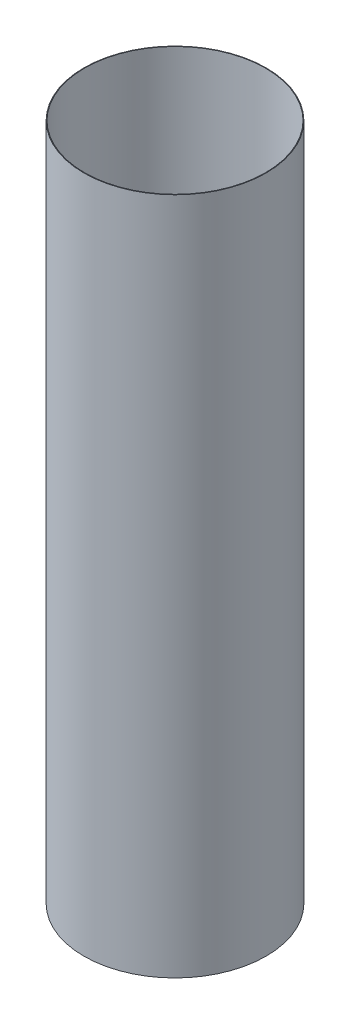
ISO-10303-21;
HEADER;
FILE_DESCRIPTION(('STEP AP214'),'2;1');
FILE_NAME('part.step','',(''),(''),'','','');
FILE_SCHEMA(('AUTOMOTIVE_DESIGN { 1 0 10303 214 1 1 1 1 }'));
ENDSEC;
DATA;
#1=APPLICATION_CONTEXT('core data for automotive mechanical design processes');
#2=APPLICATION_PROTOCOL_DEFINITION('international standard','automotive_design',2000,#1);
#3=PRODUCT_CONTEXT('',#1,'mechanical');
#4=PRODUCT('Part','Part','',(#3));
#5=PRODUCT_RELATED_PRODUCT_CATEGORY('part','',(#4));
#6=PRODUCT_DEFINITION_FORMATION('','',#4);
#7=PRODUCT_DEFINITION_CONTEXT('part definition',#1,'design');
#8=PRODUCT_DEFINITION('design','',#6,#7);
#9=PRODUCT_DEFINITION_SHAPE('','',#8);
#10=(LENGTH_UNIT() NAMED_UNIT(*) SI_UNIT(.MILLI.,.METRE.));
#11=(NAMED_UNIT(*) PLANE_ANGLE_UNIT() SI_UNIT($,.RADIAN.));
#12=(NAMED_UNIT(*) SI_UNIT($,.STERADIAN.) SOLID_ANGLE_UNIT());
#13=UNCERTAINTY_MEASURE_WITH_UNIT(LENGTH_MEASURE(1.E-05),#10,'distance_accuracy_value','');
#14=(GEOMETRIC_REPRESENTATION_CONTEXT(3) GLOBAL_UNCERTAINTY_ASSIGNED_CONTEXT((#13)) GLOBAL_UNIT_ASSIGNED_CONTEXT((#10,
#11,#12)) REPRESENTATION_CONTEXT('',''));
#15=CARTESIAN_POINT('',(0.,0.,0.));
#16=DIRECTION('',(0.,0.,1.));
#17=DIRECTION('',(1.,0.,0.));
#18=AXIS2_PLACEMENT_3D('',#15,#16,#17);
#19=CARTESIAN_POINT('',(0.,574.708528,0.));
#20=DIRECTION('',(0.,1.,0.));
#21=DIRECTION('',(0.,0.,1.));
#22=AXIS2_PLACEMENT_3D('',#19,#20,#21);
#23=PLANE('',#22);
#24=CARTESIAN_POINT('',(0.,574.708528,0.));
#25=DIRECTION('',(0.,1.,0.));
#26=DIRECTION('',(0.,0.,1.));
#27=AXIS2_PLACEMENT_3D('',#24,#25,#26);
#28=CIRCLE('',#27,77.216);
#29=CARTESIAN_POINT('',(0.,574.708528,77.216));
#30=VERTEX_POINT('',#29);
#31=EDGE_CURVE('E10',#30,#30,#28,.T.);
#32=ORIENTED_EDGE('',*,*,#31,.T.);
#33=EDGE_LOOP('',(#32));
#34=FACE_BOUND('',#33,.T.);
#35=CARTESIAN_POINT('',(0.,574.708528,0.));
#36=DIRECTION('',(0.,1.,0.));
#37=DIRECTION('',(0.,0.,1.));
#38=AXIS2_PLACEMENT_3D('',#35,#36,#37);
#39=CIRCLE('',#38,76.708);
#40=CARTESIAN_POINT('',(0.,574.708528,76.708));
#41=VERTEX_POINT('',#40);
#42=EDGE_CURVE('E42',#41,#41,#39,.T.);
#43=ORIENTED_EDGE('',*,*,#42,.F.);
#44=EDGE_LOOP('',(#43));
#45=FACE_BOUND('',#44,.T.);
#46=ADVANCED_FACE('F31',(#34,#45),#23,.T.);
#47=CARTESIAN_POINT('',(0.,0.,0.));
#48=DIRECTION('',(0.,1.,0.));
#49=DIRECTION('',(0.,0.,1.));
#50=AXIS2_PLACEMENT_3D('',#47,#48,#49);
#51=PLANE('',#50);
#52=CARTESIAN_POINT('',(0.,0.,0.));
#53=DIRECTION('',(0.,1.,0.));
#54=DIRECTION('',(0.,0.,1.));
#55=AXIS2_PLACEMENT_3D('',#52,#53,#54);
#56=CIRCLE('',#55,77.216);
#57=CARTESIAN_POINT('',(0.,0.,77.216));
#58=VERTEX_POINT('',#57);
#59=EDGE_CURVE('E35',#58,#58,#56,.T.);
#60=ORIENTED_EDGE('',*,*,#59,.F.);
#61=EDGE_LOOP('',(#60));
#62=FACE_BOUND('',#61,.T.);
#63=CARTESIAN_POINT('',(0.,0.,0.));
#64=DIRECTION('',(0.,1.,0.));
#65=DIRECTION('',(0.,0.,1.));
#66=AXIS2_PLACEMENT_3D('',#63,#64,#65);
#67=CIRCLE('',#66,76.708);
#68=CARTESIAN_POINT('',(0.,0.,76.708));
#69=VERTEX_POINT('',#68);
#70=EDGE_CURVE('E44',#69,#69,#67,.T.);
#71=ORIENTED_EDGE('',*,*,#70,.T.);
#72=EDGE_LOOP('',(#71));
#73=FACE_BOUND('',#72,.T.);
#74=ADVANCED_FACE('F54',(#62,#73),#51,.F.);
#75=CARTESIAN_POINT('',(0.,574.708528,0.));
#76=DIRECTION('',(0.,-1.,0.));
#77=DIRECTION('',(0.,0.,-1.));
#78=AXIS2_PLACEMENT_3D('',#75,#76,#77);
#79=CYLINDRICAL_SURFACE('',#78,77.216);
#80=ORIENTED_EDGE('',*,*,#31,.F.);
#81=EDGE_LOOP('',(#80));
#82=FACE_BOUND('',#81,.T.);
#83=ORIENTED_EDGE('',*,*,#59,.T.);
#84=EDGE_LOOP('',(#83));
#85=FACE_BOUND('',#84,.T.);
#86=ADVANCED_FACE('F33',(#82,#85),#79,.T.);
#87=CARTESIAN_POINT('',(0.,574.708528,0.));
#88=DIRECTION('',(0.,-1.,0.));
#89=DIRECTION('',(0.,0.,-1.));
#90=AXIS2_PLACEMENT_3D('',#87,#88,#89);
#91=CYLINDRICAL_SURFACE('',#90,76.708);
#92=ORIENTED_EDGE('',*,*,#42,.T.);
#93=EDGE_LOOP('',(#92));
#94=FACE_BOUND('',#93,.T.);
#95=ORIENTED_EDGE('',*,*,#70,.F.);
#96=EDGE_LOOP('',(#95));
#97=FACE_BOUND('',#96,.T.);
#98=ADVANCED_FACE('F50',(#94,#97),#91,.F.);
#99=CLOSED_SHELL('',(#46,#74,#86,#98));
#100=MANIFOLD_SOLID_BREP('B2',#99);
#101=ADVANCED_BREP_SHAPE_REPRESENTATION('',(#18,#100),#14);
#102=SHAPE_DEFINITION_REPRESENTATION(#9,#101);
ENDSEC;
END-ISO-10303-21;
